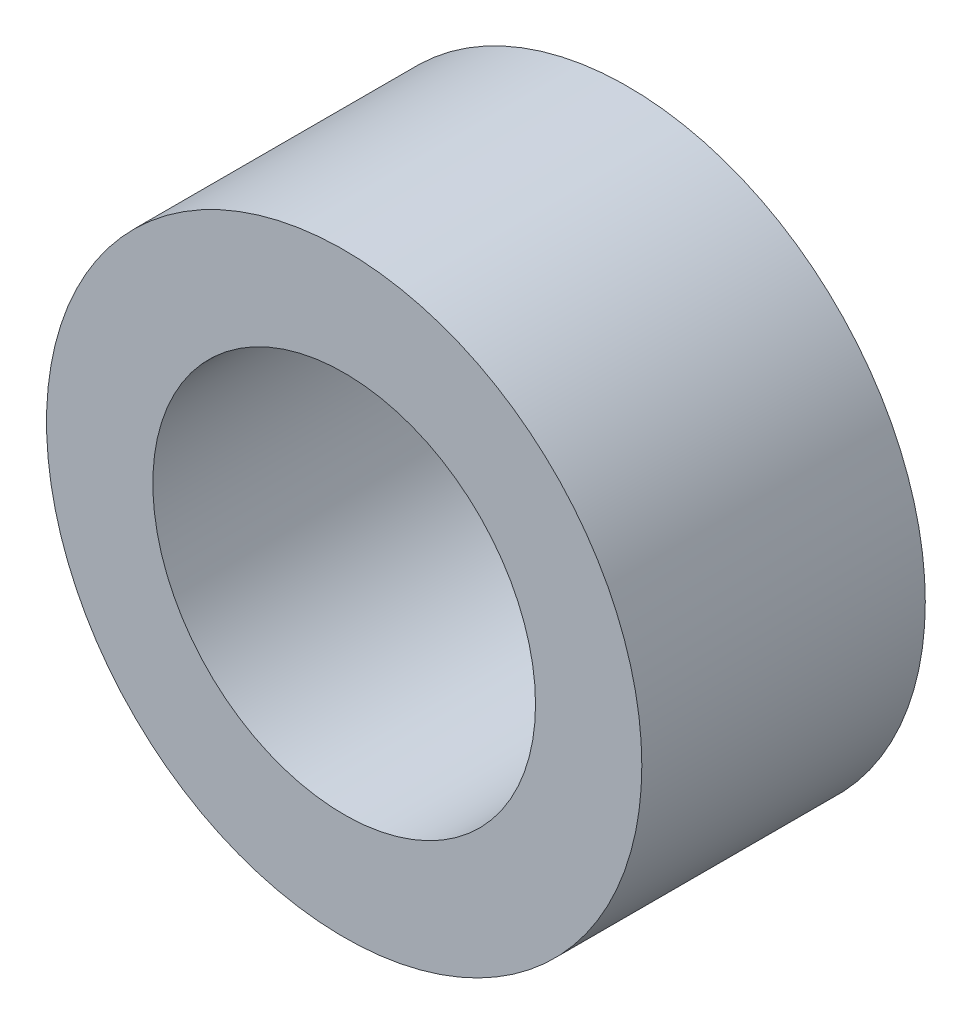
ISO-10303-21;
HEADER;
FILE_DESCRIPTION(('STEP AP214'),'2;1');
FILE_NAME('part.step','',(''),(''),'','','');
FILE_SCHEMA(('AUTOMOTIVE_DESIGN { 1 0 10303 214 1 1 1 1 }'));
ENDSEC;
DATA;
#1=APPLICATION_CONTEXT('core data for automotive mechanical design processes');
#2=APPLICATION_PROTOCOL_DEFINITION('international standard','automotive_design',2000,#1);
#3=PRODUCT_CONTEXT('',#1,'mechanical');
#4=PRODUCT('Part','Part','',(#3));
#5=PRODUCT_RELATED_PRODUCT_CATEGORY('part','',(#4));
#6=PRODUCT_DEFINITION_FORMATION('','',#4);
#7=PRODUCT_DEFINITION_CONTEXT('part definition',#1,'design');
#8=PRODUCT_DEFINITION('design','',#6,#7);
#9=PRODUCT_DEFINITION_SHAPE('','',#8);
#10=(LENGTH_UNIT() NAMED_UNIT(*) SI_UNIT(.MILLI.,.METRE.));
#11=(NAMED_UNIT(*) PLANE_ANGLE_UNIT() SI_UNIT($,.RADIAN.));
#12=(NAMED_UNIT(*) SI_UNIT($,.STERADIAN.) SOLID_ANGLE_UNIT());
#13=UNCERTAINTY_MEASURE_WITH_UNIT(LENGTH_MEASURE(1.E-05),#10,'distance_accuracy_value','');
#14=(GEOMETRIC_REPRESENTATION_CONTEXT(3) GLOBAL_UNCERTAINTY_ASSIGNED_CONTEXT((#13)) GLOBAL_UNIT_ASSIGNED_CONTEXT((#10,
#11,#12)) REPRESENTATION_CONTEXT('',''));
#15=CARTESIAN_POINT('',(0.,0.,0.));
#16=DIRECTION('',(0.,0.,1.));
#17=DIRECTION('',(1.,0.,0.));
#18=AXIS2_PLACEMENT_3D('',#15,#16,#17);
#19=CARTESIAN_POINT('',(-12.15,6.,-3.));
#20=DIRECTION('',(0.,0.,1.));
#21=DIRECTION('',(1.,0.,0.));
#22=AXIS2_PLACEMENT_3D('',#19,#20,#21);
#23=PLANE('',#22);
#24=CARTESIAN_POINT('',(-12.15,6.,-3.));
#25=DIRECTION('',(0.,0.,1.));
#26=DIRECTION('',(1.,0.,0.));
#27=AXIS2_PLACEMENT_3D('',#24,#25,#26);
#28=CIRCLE('',#27,1.35);
#29=CARTESIAN_POINT('',(-10.8,6.,-3.));
#30=VERTEX_POINT('',#29);
#31=EDGE_CURVE('E23',#30,#30,#28,.T.);
#32=ORIENTED_EDGE('',*,*,#31,.F.);
#33=EDGE_LOOP('',(#32));
#34=FACE_BOUND('',#33,.T.);
#35=CARTESIAN_POINT('',(-12.15,6.,-3.));
#36=DIRECTION('',(0.,0.,1.));
#37=DIRECTION('',(1.,0.,0.));
#38=AXIS2_PLACEMENT_3D('',#35,#36,#37);
#39=CIRCLE('',#38,2.1);
#40=CARTESIAN_POINT('',(-10.05,6.,-3.));
#41=VERTEX_POINT('',#40);
#42=EDGE_CURVE('E57',#41,#41,#39,.T.);
#43=ORIENTED_EDGE('',*,*,#42,.T.);
#44=EDGE_LOOP('',(#43));
#45=FACE_BOUND('',#44,.T.);
#46=ADVANCED_FACE('F15',(#34,#45),#23,.T.);
#47=CARTESIAN_POINT('',(-12.15,6.,-5.));
#48=DIRECTION('',(0.,0.,1.));
#49=DIRECTION('',(1.,0.,0.));
#50=AXIS2_PLACEMENT_3D('',#47,#48,#49);
#51=PLANE('',#50);
#52=CARTESIAN_POINT('',(-12.15,6.,-5.));
#53=DIRECTION('',(0.,0.,1.));
#54=DIRECTION('',(1.,0.,0.));
#55=AXIS2_PLACEMENT_3D('',#52,#53,#54);
#56=CIRCLE('',#55,1.35);
#57=CARTESIAN_POINT('',(-10.8,6.,-5.));
#58=VERTEX_POINT('',#57);
#59=EDGE_CURVE('E9',#58,#58,#56,.T.);
#60=ORIENTED_EDGE('',*,*,#59,.T.);
#61=EDGE_LOOP('',(#60));
#62=FACE_BOUND('',#61,.T.);
#63=CARTESIAN_POINT('',(-12.15,6.,-5.));
#64=DIRECTION('',(0.,0.,1.));
#65=DIRECTION('',(1.,0.,0.));
#66=AXIS2_PLACEMENT_3D('',#63,#64,#65);
#67=CIRCLE('',#66,2.1);
#68=CARTESIAN_POINT('',(-10.05,6.,-5.));
#69=VERTEX_POINT('',#68);
#70=EDGE_CURVE('E54',#69,#69,#67,.T.);
#71=ORIENTED_EDGE('',*,*,#70,.F.);
#72=EDGE_LOOP('',(#71));
#73=FACE_BOUND('',#72,.T.);
#74=ADVANCED_FACE('F87',(#62,#73),#51,.F.);
#75=CARTESIAN_POINT('',(-12.15,6.,-5.));
#76=DIRECTION('',(0.,0.,-1.));
#77=DIRECTION('',(1.,0.,0.));
#78=AXIS2_PLACEMENT_3D('',#75,#76,#77);
#79=CYLINDRICAL_SURFACE('',#78,1.35);
#80=DIRECTION('',(0.,0.,1.));
#81=VECTOR('',#80,1.);
#82=CARTESIAN_POINT('',(-10.8,6.,-5.));
#83=LINE('',#82,#81);
#84=EDGE_CURVE('E62',#58,#30,#83,.T.);
#85=ORIENTED_EDGE('',*,*,#84,.T.);
#86=ORIENTED_EDGE('',*,*,#31,.T.);
#87=ORIENTED_EDGE('',*,*,#84,.F.);
#88=ORIENTED_EDGE('',*,*,#59,.F.);
#89=EDGE_LOOP('',(#85,#86,#87,#88));
#90=FACE_BOUND('',#89,.T.);
#91=ADVANCED_FACE('F77',(#90),#79,.F.);
#92=CARTESIAN_POINT('',(-12.15,6.,-5.));
#93=DIRECTION('',(0.,0.,-1.));
#94=DIRECTION('',(1.,0.,0.));
#95=AXIS2_PLACEMENT_3D('',#92,#93,#94);
#96=CYLINDRICAL_SURFACE('',#95,2.1);
#97=ORIENTED_EDGE('',*,*,#70,.T.);
#98=DIRECTION('',(0.,0.,1.));
#99=VECTOR('',#98,1.);
#100=CARTESIAN_POINT('',(-10.05,6.,-5.));
#101=LINE('',#100,#99);
#102=EDGE_CURVE('E55',#69,#41,#101,.T.);
#103=ORIENTED_EDGE('',*,*,#102,.T.);
#104=ORIENTED_EDGE('',*,*,#42,.F.);
#105=ORIENTED_EDGE('',*,*,#102,.F.);
#106=EDGE_LOOP('',(#97,#103,#104,#105));
#107=FACE_BOUND('',#106,.T.);
#108=ADVANCED_FACE('F52',(#107),#96,.T.);
#109=CLOSED_SHELL('',(#46,#74,#91,#108));
#110=MANIFOLD_SOLID_BREP('B1',#109);
#111=ADVANCED_BREP_SHAPE_REPRESENTATION('',(#18,#110),#14);
#112=SHAPE_DEFINITION_REPRESENTATION(#9,#111);
ENDSEC;
END-ISO-10303-21;
